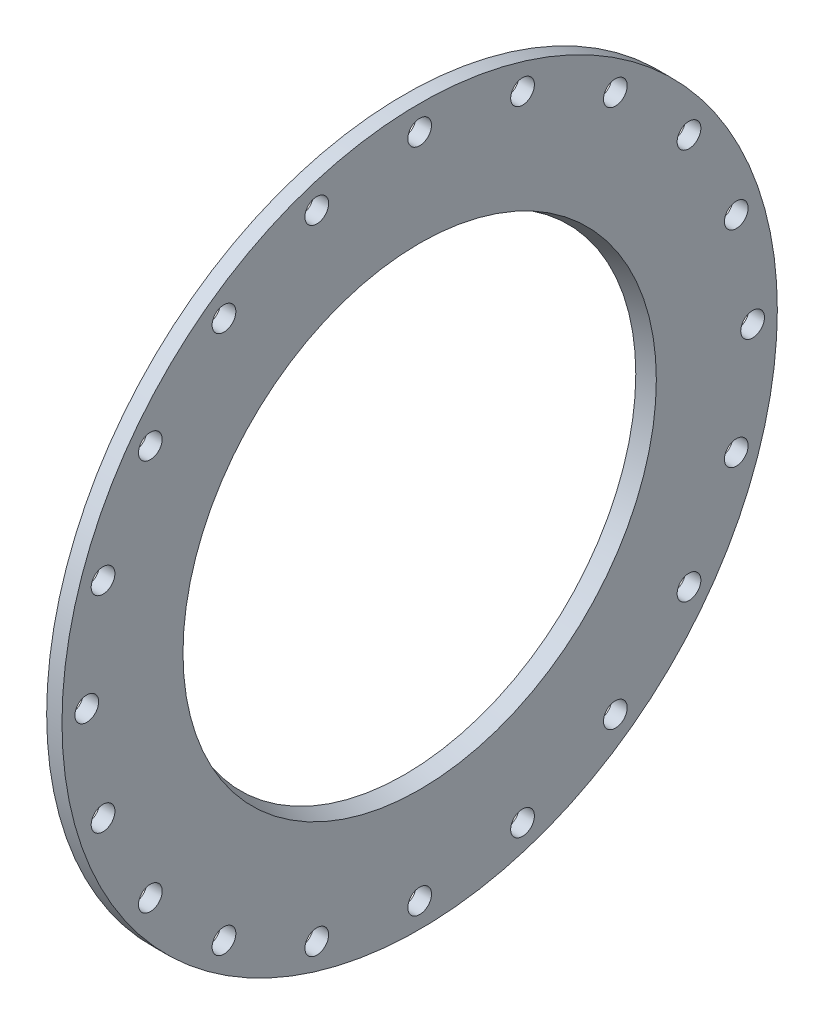
ISO-10303-21;
HEADER;
FILE_DESCRIPTION(('STEP AP214'),'2;1');
FILE_NAME('part.step','',(''),(''),'','','');
FILE_SCHEMA(('AUTOMOTIVE_DESIGN { 1 0 10303 214 1 1 1 1 }'));
ENDSEC;
DATA;
#1=APPLICATION_CONTEXT('core data for automotive mechanical design processes');
#2=APPLICATION_PROTOCOL_DEFINITION('international standard','automotive_design',2000,#1);
#3=PRODUCT_CONTEXT('',#1,'mechanical');
#4=PRODUCT('Part','Part','',(#3));
#5=PRODUCT_RELATED_PRODUCT_CATEGORY('part','',(#4));
#6=PRODUCT_DEFINITION_FORMATION('','',#4);
#7=PRODUCT_DEFINITION_CONTEXT('part definition',#1,'design');
#8=PRODUCT_DEFINITION('design','',#6,#7);
#9=PRODUCT_DEFINITION_SHAPE('','',#8);
#10=(LENGTH_UNIT() NAMED_UNIT(*) SI_UNIT(.MILLI.,.METRE.));
#11=(NAMED_UNIT(*) PLANE_ANGLE_UNIT() SI_UNIT($,.RADIAN.));
#12=(NAMED_UNIT(*) SI_UNIT($,.STERADIAN.) SOLID_ANGLE_UNIT());
#13=UNCERTAINTY_MEASURE_WITH_UNIT(LENGTH_MEASURE(1.E-05),#10,'distance_accuracy_value','');
#14=(GEOMETRIC_REPRESENTATION_CONTEXT(3) GLOBAL_UNCERTAINTY_ASSIGNED_CONTEXT((#13)) GLOBAL_UNIT_ASSIGNED_CONTEXT((#10,
#11,#12)) REPRESENTATION_CONTEXT('',''));
#15=CARTESIAN_POINT('',(0.,0.,0.));
#16=DIRECTION('',(0.,0.,1.));
#17=DIRECTION('',(1.,0.,0.));
#18=AXIS2_PLACEMENT_3D('',#15,#16,#17);
#19=CARTESIAN_POINT('',(79.9592,0.,0.));
#20=DIRECTION('',(1.,0.,0.));
#21=DIRECTION('',(0.,0.,-1.));
#22=AXIS2_PLACEMENT_3D('',#19,#20,#21);
#23=CONICAL_SURFACE('',#22,75.2237755254414,0.328785996406436);
#24=CARTESIAN_POINT('',(3.175,0.,0.));
#25=DIRECTION('',(-1.,0.,0.));
#26=DIRECTION('',(0.,0.,1.));
#27=AXIS2_PLACEMENT_3D('',#24,#25,#26);
#28=CIRCLE('',#27,49.0273870883385);
#29=CARTESIAN_POINT('',(3.175,0.,49.0273870883385));
#30=VERTEX_POINT('',#29);
#31=EDGE_CURVE('E53',#30,#30,#28,.T.);
#32=ORIENTED_EDGE('',*,*,#31,.F.);
#33=EDGE_LOOP('',(#32));
#34=FACE_BOUND('',#33,.T.);
#35=CARTESIAN_POINT('',(0.,0.,0.));
#36=DIRECTION('',(1.,0.,0.));
#37=DIRECTION('',(0.,0.,-1.));
#38=AXIS2_PLACEMENT_3D('',#35,#36,#37);
#39=CIRCLE('',#38,47.9441755254414);
#40=CARTESIAN_POINT('',(0.,0.,-47.9441755254414));
#41=VERTEX_POINT('',#40);
#42=EDGE_CURVE('E11',#41,#41,#39,.F.);
#43=ORIENTED_EDGE('',*,*,#42,.T.);
#44=EDGE_LOOP('',(#43));
#45=FACE_BOUND('',#44,.T.);
#46=ADVANCED_FACE('F46',(#34,#45),#23,.F.);
#47=CARTESIAN_POINT('',(0.,0.,0.));
#48=DIRECTION('',(-1.,0.,0.));
#49=DIRECTION('',(0.,0.,1.));
#50=AXIS2_PLACEMENT_3D('',#47,#48,#49);
#51=CYLINDRICAL_SURFACE('',#50,74.0918);
#52=CARTESIAN_POINT('',(0.,0.,0.));
#53=DIRECTION('',(-1.,0.,0.));
#54=DIRECTION('',(0.,0.,1.));
#55=AXIS2_PLACEMENT_3D('',#52,#53,#54);
#56=CIRCLE('',#55,74.0918);
#57=CARTESIAN_POINT('',(0.,0.,74.0918));
#58=VERTEX_POINT('',#57);
#59=EDGE_CURVE('E59',#58,#58,#56,.T.);
#60=ORIENTED_EDGE('',*,*,#59,.F.);
#61=EDGE_LOOP('',(#60));
#62=FACE_BOUND('',#61,.T.);
#63=CARTESIAN_POINT('',(3.175,0.,0.));
#64=DIRECTION('',(-1.,0.,0.));
#65=DIRECTION('',(0.,0.,1.));
#66=AXIS2_PLACEMENT_3D('',#63,#64,#65);
#67=CIRCLE('',#66,74.0918);
#68=CARTESIAN_POINT('',(3.175,0.,74.0918));
#69=VERTEX_POINT('',#68);
#70=EDGE_CURVE('E64',#69,#69,#67,.T.);
#71=ORIENTED_EDGE('',*,*,#70,.T.);
#72=EDGE_LOOP('',(#71));
#73=FACE_BOUND('',#72,.T.);
#74=ADVANCED_FACE('F287',(#62,#73),#51,.T.);
#75=CARTESIAN_POINT('',(0.,68.961,0.));
#76=DIRECTION('',(-1.,0.,0.));
#77=DIRECTION('',(0.,0.,1.));
#78=AXIS2_PLACEMENT_3D('',#75,#76,#77);
#79=CYLINDRICAL_SURFACE('',#78,2.45745);
#80=CARTESIAN_POINT('',(3.175,68.961,0.));
#81=DIRECTION('',(-1.,0.,0.));
#82=DIRECTION('',(0.,0.,1.));
#83=AXIS2_PLACEMENT_3D('',#80,#81,#82);
#84=CIRCLE('',#83,2.45745);
#85=CARTESIAN_POINT('',(3.175,68.961,2.45745));
#86=VERTEX_POINT('',#85);
#87=EDGE_CURVE('E123',#86,#86,#84,.T.);
#88=ORIENTED_EDGE('',*,*,#87,.F.);
#89=EDGE_LOOP('',(#88));
#90=FACE_BOUND('',#89,.T.);
#91=CARTESIAN_POINT('',(0.,68.961,0.));
#92=DIRECTION('',(-1.,0.,0.));
#93=DIRECTION('',(0.,0.,1.));
#94=AXIS2_PLACEMENT_3D('',#91,#92,#93);
#95=CIRCLE('',#94,2.45745);
#96=CARTESIAN_POINT('',(0.,68.961,2.45745));
#97=VERTEX_POINT('',#96);
#98=EDGE_CURVE('E117',#97,#97,#95,.T.);
#99=ORIENTED_EDGE('',*,*,#98,.T.);
#100=EDGE_LOOP('',(#99));
#101=FACE_BOUND('',#100,.T.);
#102=ADVANCED_FACE('F292',(#90,#101),#79,.F.);
#103=CARTESIAN_POINT('',(0.,65.5858084202301,-21.3101209490908));
#104=DIRECTION('',(-1.,0.,0.));
#105=DIRECTION('',(0.,0.,1.));
#106=AXIS2_PLACEMENT_3D('',#103,#104,#105);
#107=CYLINDRICAL_SURFACE('',#106,2.45745);
#108=CARTESIAN_POINT('',(3.175,65.5858084202301,-21.3101209490908));
#109=DIRECTION('',(-1.,0.,0.));
#110=DIRECTION('',(0.,0.,1.));
#111=AXIS2_PLACEMENT_3D('',#108,#109,#110);
#112=CIRCLE('',#111,2.45745);
#113=CARTESIAN_POINT('',(3.175,65.5858084202301,-18.8526709490908));
#114=VERTEX_POINT('',#113);
#115=EDGE_CURVE('E111',#114,#114,#112,.T.);
#116=ORIENTED_EDGE('',*,*,#115,.F.);
#117=EDGE_LOOP('',(#116));
#118=FACE_BOUND('',#117,.T.);
#119=CARTESIAN_POINT('',(0.,65.5858084202301,-21.3101209490908));
#120=DIRECTION('',(-1.,0.,0.));
#121=DIRECTION('',(0.,0.,1.));
#122=AXIS2_PLACEMENT_3D('',#119,#120,#121);
#123=CIRCLE('',#122,2.45745);
#124=CARTESIAN_POINT('',(0.,65.5858084202301,-18.8526709490908));
#125=VERTEX_POINT('',#124);
#126=EDGE_CURVE('E118',#125,#125,#123,.T.);
#127=ORIENTED_EDGE('',*,*,#126,.T.);
#128=EDGE_LOOP('',(#127));
#129=FACE_BOUND('',#128,.T.);
#130=ADVANCED_FACE('F298',(#118,#129),#107,.F.);
#131=CARTESIAN_POINT('',(0.,55.7906209490907,-40.5342587833413));
#132=DIRECTION('',(-1.,0.,0.));
#133=DIRECTION('',(0.,0.,1.));
#134=AXIS2_PLACEMENT_3D('',#131,#132,#133);
#135=CYLINDRICAL_SURFACE('',#134,2.45745);
#136=CARTESIAN_POINT('',(3.175,55.7906209490907,-40.5342587833413));
#137=DIRECTION('',(-1.,0.,0.));
#138=DIRECTION('',(0.,0.,1.));
#139=AXIS2_PLACEMENT_3D('',#136,#137,#138);
#140=CIRCLE('',#139,2.45745);
#141=CARTESIAN_POINT('',(3.175,55.7906209490907,-38.0768087833413));
#142=VERTEX_POINT('',#141);
#143=EDGE_CURVE('E720',#142,#142,#140,.T.);
#144=ORIENTED_EDGE('',*,*,#143,.F.);
#145=EDGE_LOOP('',(#144));
#146=FACE_BOUND('',#145,.T.);
#147=CARTESIAN_POINT('',(0.,55.7906209490907,-40.5342587833413));
#148=DIRECTION('',(-1.,0.,0.));
#149=DIRECTION('',(0.,0.,1.));
#150=AXIS2_PLACEMENT_3D('',#147,#148,#149);
#151=CIRCLE('',#150,2.45745);
#152=CARTESIAN_POINT('',(0.,55.7906209490907,-38.0768087833413));
#153=VERTEX_POINT('',#152);
#154=EDGE_CURVE('E258',#153,#153,#151,.T.);
#155=ORIENTED_EDGE('',*,*,#154,.T.);
#156=EDGE_LOOP('',(#155));
#157=FACE_BOUND('',#156,.T.);
#158=ADVANCED_FACE('F309',(#146,#157),#135,.F.);
#159=CARTESIAN_POINT('',(0.,40.5342587833411,-55.7906209490908));
#160=DIRECTION('',(-1.,0.,0.));
#161=DIRECTION('',(0.,0.,1.));
#162=AXIS2_PLACEMENT_3D('',#159,#160,#161);
#163=CYLINDRICAL_SURFACE('',#162,2.45745);
#164=CARTESIAN_POINT('',(3.175,40.5342587833411,-55.7906209490908));
#165=DIRECTION('',(-1.,0.,0.));
#166=DIRECTION('',(0.,0.,1.));
#167=AXIS2_PLACEMENT_3D('',#164,#165,#166);
#168=CIRCLE('',#167,2.45745);
#169=CARTESIAN_POINT('',(3.175,40.5342587833411,-53.3331709490908));
#170=VERTEX_POINT('',#169);
#171=EDGE_CURVE('E358',#170,#170,#168,.T.);
#172=ORIENTED_EDGE('',*,*,#171,.F.);
#173=EDGE_LOOP('',(#172));
#174=FACE_BOUND('',#173,.T.);
#175=CARTESIAN_POINT('',(0.,40.5342587833411,-55.7906209490908));
#176=DIRECTION('',(-1.,0.,0.));
#177=DIRECTION('',(0.,0.,1.));
#178=AXIS2_PLACEMENT_3D('',#175,#176,#177);
#179=CIRCLE('',#178,2.45745);
#180=CARTESIAN_POINT('',(0.,40.5342587833411,-53.3331709490908));
#181=VERTEX_POINT('',#180);
#182=EDGE_CURVE('E254',#181,#181,#179,.T.);
#183=ORIENTED_EDGE('',*,*,#182,.T.);
#184=EDGE_LOOP('',(#183));
#185=FACE_BOUND('',#184,.T.);
#186=ADVANCED_FACE('F313',(#174,#185),#163,.F.);
#187=CARTESIAN_POINT('',(0.,21.3101209490906,-65.5858084202302));
#188=DIRECTION('',(-1.,0.,0.));
#189=DIRECTION('',(0.,0.,1.));
#190=AXIS2_PLACEMENT_3D('',#187,#188,#189);
#191=CYLINDRICAL_SURFACE('',#190,2.45745);
#192=CARTESIAN_POINT('',(3.175,21.3101209490906,-65.5858084202302));
#193=DIRECTION('',(-1.,0.,0.));
#194=DIRECTION('',(0.,0.,1.));
#195=AXIS2_PLACEMENT_3D('',#192,#193,#194);
#196=CIRCLE('',#195,2.45745);
#197=CARTESIAN_POINT('',(3.175,21.3101209490906,-63.1283584202301));
#198=VERTEX_POINT('',#197);
#199=EDGE_CURVE('E139',#198,#198,#196,.T.);
#200=ORIENTED_EDGE('',*,*,#199,.F.);
#201=EDGE_LOOP('',(#200));
#202=FACE_BOUND('',#201,.T.);
#203=CARTESIAN_POINT('',(0.,21.3101209490906,-65.5858084202302));
#204=DIRECTION('',(-1.,0.,0.));
#205=DIRECTION('',(0.,0.,1.));
#206=AXIS2_PLACEMENT_3D('',#203,#204,#205);
#207=CIRCLE('',#206,2.45745);
#208=CARTESIAN_POINT('',(0.,21.3101209490906,-63.1283584202301));
#209=VERTEX_POINT('',#208);
#210=EDGE_CURVE('E133',#209,#209,#207,.T.);
#211=ORIENTED_EDGE('',*,*,#210,.T.);
#212=EDGE_LOOP('',(#211));
#213=FACE_BOUND('',#212,.T.);
#214=ADVANCED_FACE('F317',(#202,#213),#191,.F.);
#215=CARTESIAN_POINT('',(0.,-2.40776044607961E-13,-68.961));
#216=DIRECTION('',(-1.,0.,0.));
#217=DIRECTION('',(0.,0.,1.));
#218=AXIS2_PLACEMENT_3D('',#215,#216,#217);
#219=CYLINDRICAL_SURFACE('',#218,2.45745);
#220=CARTESIAN_POINT('',(3.175,-2.40776044607961E-13,-68.961));
#221=DIRECTION('',(-1.,0.,0.));
#222=DIRECTION('',(0.,0.,1.));
#223=AXIS2_PLACEMENT_3D('',#220,#221,#222);
#224=CIRCLE('',#223,2.45745);
#225=CARTESIAN_POINT('',(3.175,-2.40776044607961E-13,-66.50355));
#226=VERTEX_POINT('',#225);
#227=EDGE_CURVE('E140',#226,#226,#224,.T.);
#228=ORIENTED_EDGE('',*,*,#227,.F.);
#229=EDGE_LOOP('',(#228));
#230=FACE_BOUND('',#229,.T.);
#231=CARTESIAN_POINT('',(0.,-2.40776044607961E-13,-68.961));
#232=DIRECTION('',(-1.,0.,0.));
#233=DIRECTION('',(0.,0.,1.));
#234=AXIS2_PLACEMENT_3D('',#231,#232,#233);
#235=CIRCLE('',#234,2.45745);
#236=CARTESIAN_POINT('',(0.,-2.40776044607961E-13,-66.50355));
#237=VERTEX_POINT('',#236);
#238=EDGE_CURVE('E250',#237,#237,#235,.T.);
#239=ORIENTED_EDGE('',*,*,#238,.T.);
#240=EDGE_LOOP('',(#239));
#241=FACE_BOUND('',#240,.T.);
#242=ADVANCED_FACE('F321',(#230,#241),#219,.F.);
#243=CARTESIAN_POINT('',(0.,-21.310120949091,-65.58580842023));
#244=DIRECTION('',(-1.,0.,0.));
#245=DIRECTION('',(0.,0.,1.));
#246=AXIS2_PLACEMENT_3D('',#243,#244,#245);
#247=CYLINDRICAL_SURFACE('',#246,2.45745);
#248=CARTESIAN_POINT('',(3.175,-21.310120949091,-65.58580842023));
#249=DIRECTION('',(-1.,0.,0.));
#250=DIRECTION('',(0.,0.,1.));
#251=AXIS2_PLACEMENT_3D('',#248,#249,#250);
#252=CIRCLE('',#251,2.45745);
#253=CARTESIAN_POINT('',(3.175,-21.310120949091,-63.12835842023));
#254=VERTEX_POINT('',#253);
#255=EDGE_CURVE('E333',#254,#254,#252,.T.);
#256=ORIENTED_EDGE('',*,*,#255,.F.);
#257=EDGE_LOOP('',(#256));
#258=FACE_BOUND('',#257,.T.);
#259=CARTESIAN_POINT('',(0.,-21.310120949091,-65.58580842023));
#260=DIRECTION('',(-1.,0.,0.));
#261=DIRECTION('',(0.,0.,1.));
#262=AXIS2_PLACEMENT_3D('',#259,#260,#261);
#263=CIRCLE('',#262,2.45745);
#264=CARTESIAN_POINT('',(0.,-21.310120949091,-63.12835842023));
#265=VERTEX_POINT('',#264);
#266=EDGE_CURVE('E246',#265,#265,#263,.T.);
#267=ORIENTED_EDGE('',*,*,#266,.T.);
#268=EDGE_LOOP('',(#267));
#269=FACE_BOUND('',#268,.T.);
#270=ADVANCED_FACE('F282',(#258,#269),#247,.F.);
#271=CARTESIAN_POINT('',(0.,-40.5342587833415,-55.7906209490905));
#272=DIRECTION('',(-1.,0.,0.));
#273=DIRECTION('',(0.,0.,1.));
#274=AXIS2_PLACEMENT_3D('',#271,#272,#273);
#275=CYLINDRICAL_SURFACE('',#274,2.45745);
#276=CARTESIAN_POINT('',(3.175,-40.5342587833415,-55.7906209490905));
#277=DIRECTION('',(-1.,0.,0.));
#278=DIRECTION('',(0.,0.,1.));
#279=AXIS2_PLACEMENT_3D('',#276,#277,#278);
#280=CIRCLE('',#279,2.45745);
#281=CARTESIAN_POINT('',(3.175,-40.5342587833415,-53.3331709490906));
#282=VERTEX_POINT('',#281);
#283=EDGE_CURVE('E335',#282,#282,#280,.T.);
#284=ORIENTED_EDGE('',*,*,#283,.F.);
#285=EDGE_LOOP('',(#284));
#286=FACE_BOUND('',#285,.T.);
#287=CARTESIAN_POINT('',(0.,-40.5342587833415,-55.7906209490905));
#288=DIRECTION('',(-1.,0.,0.));
#289=DIRECTION('',(0.,0.,1.));
#290=AXIS2_PLACEMENT_3D('',#287,#288,#289);
#291=CIRCLE('',#290,2.45745);
#292=CARTESIAN_POINT('',(0.,-40.5342587833415,-53.3331709490906));
#293=VERTEX_POINT('',#292);
#294=EDGE_CURVE('E165',#293,#293,#291,.T.);
#295=ORIENTED_EDGE('',*,*,#294,.T.);
#296=EDGE_LOOP('',(#295));
#297=FACE_BOUND('',#296,.T.);
#298=ADVANCED_FACE('F273',(#286,#297),#275,.F.);
#299=CARTESIAN_POINT('',(0.,-55.790620949091,-40.5342587833409));
#300=DIRECTION('',(-1.,0.,0.));
#301=DIRECTION('',(0.,0.,1.));
#302=AXIS2_PLACEMENT_3D('',#299,#300,#301);
#303=CYLINDRICAL_SURFACE('',#302,2.45745);
#304=CARTESIAN_POINT('',(3.175,-55.790620949091,-40.5342587833409));
#305=DIRECTION('',(-1.,0.,0.));
#306=DIRECTION('',(0.,0.,1.));
#307=AXIS2_PLACEMENT_3D('',#304,#305,#306);
#308=CIRCLE('',#307,2.45745);
#309=CARTESIAN_POINT('',(3.175,-55.790620949091,-38.0768087833409));
#310=VERTEX_POINT('',#309);
#311=EDGE_CURVE('E156',#310,#310,#308,.T.);
#312=ORIENTED_EDGE('',*,*,#311,.F.);
#313=EDGE_LOOP('',(#312));
#314=FACE_BOUND('',#313,.T.);
#315=CARTESIAN_POINT('',(0.,-55.790620949091,-40.5342587833409));
#316=DIRECTION('',(-1.,0.,0.));
#317=DIRECTION('',(0.,0.,1.));
#318=AXIS2_PLACEMENT_3D('',#315,#316,#317);
#319=CIRCLE('',#318,2.45745);
#320=CARTESIAN_POINT('',(0.,-55.790620949091,-38.0768087833409));
#321=VERTEX_POINT('',#320);
#322=EDGE_CURVE('E150',#321,#321,#319,.T.);
#323=ORIENTED_EDGE('',*,*,#322,.T.);
#324=EDGE_LOOP('',(#323));
#325=FACE_BOUND('',#324,.T.);
#326=ADVANCED_FACE('F271',(#314,#325),#303,.F.);
#327=CARTESIAN_POINT('',(0.,-65.5858084202302,-21.3101209490903));
#328=DIRECTION('',(-1.,0.,0.));
#329=DIRECTION('',(0.,0.,1.));
#330=AXIS2_PLACEMENT_3D('',#327,#328,#329);
#331=CYLINDRICAL_SURFACE('',#330,2.45745);
#332=CARTESIAN_POINT('',(3.175,-65.5858084202302,-21.3101209490903));
#333=DIRECTION('',(-1.,0.,0.));
#334=DIRECTION('',(0.,0.,1.));
#335=AXIS2_PLACEMENT_3D('',#332,#333,#334);
#336=CIRCLE('',#335,2.45745);
#337=CARTESIAN_POINT('',(3.175,-65.5858084202302,-18.8526709490903));
#338=VERTEX_POINT('',#337);
#339=EDGE_CURVE('E157',#338,#338,#336,.T.);
#340=ORIENTED_EDGE('',*,*,#339,.F.);
#341=EDGE_LOOP('',(#340));
#342=FACE_BOUND('',#341,.T.);
#343=CARTESIAN_POINT('',(0.,-65.5858084202302,-21.3101209490903));
#344=DIRECTION('',(-1.,0.,0.));
#345=DIRECTION('',(0.,0.,1.));
#346=AXIS2_PLACEMENT_3D('',#343,#344,#345);
#347=CIRCLE('',#346,2.45745);
#348=CARTESIAN_POINT('',(0.,-65.5858084202302,-18.8526709490903));
#349=VERTEX_POINT('',#348);
#350=EDGE_CURVE('E211',#349,#349,#347,.T.);
#351=ORIENTED_EDGE('',*,*,#350,.T.);
#352=EDGE_LOOP('',(#351));
#353=FACE_BOUND('',#352,.T.);
#354=ADVANCED_FACE('F231',(#342,#353),#331,.F.);
#355=CARTESIAN_POINT('',(0.,-68.961,0.));
#356=DIRECTION('',(-1.,0.,0.));
#357=DIRECTION('',(0.,0.,1.));
#358=AXIS2_PLACEMENT_3D('',#355,#356,#357);
#359=CYLINDRICAL_SURFACE('',#358,2.45745);
#360=CARTESIAN_POINT('',(3.175,-68.961,0.));
#361=DIRECTION('',(-1.,0.,0.));
#362=DIRECTION('',(0.,0.,1.));
#363=AXIS2_PLACEMENT_3D('',#360,#361,#362);
#364=CIRCLE('',#363,2.45745);
#365=CARTESIAN_POINT('',(3.175,-68.961,2.45745));
#366=VERTEX_POINT('',#365);
#367=EDGE_CURVE('E205',#366,#366,#364,.T.);
#368=ORIENTED_EDGE('',*,*,#367,.F.);
#369=EDGE_LOOP('',(#368));
#370=FACE_BOUND('',#369,.T.);
#371=CARTESIAN_POINT('',(0.,-68.961,0.));
#372=DIRECTION('',(-1.,0.,0.));
#373=DIRECTION('',(0.,0.,1.));
#374=AXIS2_PLACEMENT_3D('',#371,#372,#373);
#375=CIRCLE('',#374,2.45745);
#376=CARTESIAN_POINT('',(0.,-68.961,2.45745));
#377=VERTEX_POINT('',#376);
#378=EDGE_CURVE('E201',#377,#377,#375,.T.);
#379=ORIENTED_EDGE('',*,*,#378,.T.);
#380=EDGE_LOOP('',(#379));
#381=FACE_BOUND('',#380,.T.);
#382=ADVANCED_FACE('F227',(#370,#381),#359,.F.);
#383=CARTESIAN_POINT('',(0.,-65.5858084202299,21.3101209490913));
#384=DIRECTION('',(-1.,0.,0.));
#385=DIRECTION('',(0.,0.,1.));
#386=AXIS2_PLACEMENT_3D('',#383,#384,#385);
#387=CYLINDRICAL_SURFACE('',#386,2.45745);
#388=CARTESIAN_POINT('',(3.175,-65.5858084202299,21.3101209490913));
#389=DIRECTION('',(-1.,0.,0.));
#390=DIRECTION('',(0.,0.,1.));
#391=AXIS2_PLACEMENT_3D('',#388,#389,#390);
#392=CIRCLE('',#391,2.45745);
#393=CARTESIAN_POINT('',(3.175,-65.5858084202299,23.7675709490913));
#394=VERTEX_POINT('',#393);
#395=EDGE_CURVE('E188',#394,#394,#392,.T.);
#396=ORIENTED_EDGE('',*,*,#395,.F.);
#397=EDGE_LOOP('',(#396));
#398=FACE_BOUND('',#397,.T.);
#399=CARTESIAN_POINT('',(0.,-65.5858084202299,21.3101209490913));
#400=DIRECTION('',(-1.,0.,0.));
#401=DIRECTION('',(0.,0.,1.));
#402=AXIS2_PLACEMENT_3D('',#399,#400,#401);
#403=CIRCLE('',#402,2.45745);
#404=CARTESIAN_POINT('',(0.,-65.5858084202299,23.7675709490913));
#405=VERTEX_POINT('',#404);
#406=EDGE_CURVE('E181',#405,#405,#403,.T.);
#407=ORIENTED_EDGE('',*,*,#406,.T.);
#408=EDGE_LOOP('',(#407));
#409=FACE_BOUND('',#408,.T.);
#410=ADVANCED_FACE('F230',(#398,#409),#387,.F.);
#411=CARTESIAN_POINT('',(0.,-55.7906209490904,40.5342587833417));
#412=DIRECTION('',(-1.,0.,0.));
#413=DIRECTION('',(0.,0.,1.));
#414=AXIS2_PLACEMENT_3D('',#411,#412,#413);
#415=CYLINDRICAL_SURFACE('',#414,2.45745);
#416=CARTESIAN_POINT('',(3.175,-55.7906209490904,40.5342587833417));
#417=DIRECTION('',(-1.,0.,0.));
#418=DIRECTION('',(0.,0.,1.));
#419=AXIS2_PLACEMENT_3D('',#416,#417,#418);
#420=CIRCLE('',#419,2.45745);
#421=CARTESIAN_POINT('',(3.175,-55.7906209490904,42.9917087833417));
#422=VERTEX_POINT('',#421);
#423=EDGE_CURVE('E175',#422,#422,#420,.T.);
#424=ORIENTED_EDGE('',*,*,#423,.F.);
#425=EDGE_LOOP('',(#424));
#426=FACE_BOUND('',#425,.T.);
#427=CARTESIAN_POINT('',(0.,-55.7906209490904,40.5342587833417));
#428=DIRECTION('',(-1.,0.,0.));
#429=DIRECTION('',(0.,0.,1.));
#430=AXIS2_PLACEMENT_3D('',#427,#428,#429);
#431=CIRCLE('',#430,2.45745);
#432=CARTESIAN_POINT('',(0.,-55.7906209490904,42.9917087833417));
#433=VERTEX_POINT('',#432);
#434=EDGE_CURVE('E182',#433,#433,#431,.T.);
#435=ORIENTED_EDGE('',*,*,#434,.T.);
#436=EDGE_LOOP('',(#435));
#437=FACE_BOUND('',#436,.T.);
#438=ADVANCED_FACE('F433',(#426,#437),#415,.F.);
#439=CARTESIAN_POINT('',(0.,-40.5342587833407,55.7906209490911));
#440=DIRECTION('',(-1.,0.,0.));
#441=DIRECTION('',(0.,0.,1.));
#442=AXIS2_PLACEMENT_3D('',#439,#440,#441);
#443=CYLINDRICAL_SURFACE('',#442,2.45745);
#444=CARTESIAN_POINT('',(3.175,-40.5342587833407,55.7906209490911));
#445=DIRECTION('',(-1.,0.,0.));
#446=DIRECTION('',(0.,0.,1.));
#447=AXIS2_PLACEMENT_3D('',#444,#445,#446);
#448=CIRCLE('',#447,2.45745);
#449=CARTESIAN_POINT('',(3.175,-40.5342587833407,58.2480709490911));
#450=VERTEX_POINT('',#449);
#451=EDGE_CURVE('E413',#450,#450,#448,.T.);
#452=ORIENTED_EDGE('',*,*,#451,.F.);
#453=EDGE_LOOP('',(#452));
#454=FACE_BOUND('',#453,.T.);
#455=CARTESIAN_POINT('',(0.,-40.5342587833407,55.7906209490911));
#456=DIRECTION('',(-1.,0.,0.));
#457=DIRECTION('',(0.,0.,1.));
#458=AXIS2_PLACEMENT_3D('',#455,#456,#457);
#459=CIRCLE('',#458,2.45745);
#460=CARTESIAN_POINT('',(0.,-40.5342587833407,58.2480709490911));
#461=VERTEX_POINT('',#460);
#462=EDGE_CURVE('E407',#461,#461,#459,.T.);
#463=ORIENTED_EDGE('',*,*,#462,.T.);
#464=EDGE_LOOP('',(#463));
#465=FACE_BOUND('',#464,.T.);
#466=ADVANCED_FACE('F425',(#454,#465),#443,.F.);
#467=CARTESIAN_POINT('',(0.,-21.3101209490901,65.5858084202303));
#468=DIRECTION('',(-1.,0.,0.));
#469=DIRECTION('',(0.,0.,1.));
#470=AXIS2_PLACEMENT_3D('',#467,#468,#469);
#471=CYLINDRICAL_SURFACE('',#470,2.45745);
#472=CARTESIAN_POINT('',(3.175,-21.3101209490901,65.5858084202303));
#473=DIRECTION('',(-1.,0.,0.));
#474=DIRECTION('',(0.,0.,1.));
#475=AXIS2_PLACEMENT_3D('',#472,#473,#474);
#476=CIRCLE('',#475,2.45745);
#477=CARTESIAN_POINT('',(3.175,-21.3101209490901,68.0432584202303));
#478=VERTEX_POINT('',#477);
#479=EDGE_CURVE('E402',#478,#478,#476,.T.);
#480=ORIENTED_EDGE('',*,*,#479,.F.);
#481=EDGE_LOOP('',(#480));
#482=FACE_BOUND('',#481,.T.);
#483=CARTESIAN_POINT('',(0.,-21.3101209490901,65.5858084202303));
#484=DIRECTION('',(-1.,0.,0.));
#485=DIRECTION('',(0.,0.,1.));
#486=AXIS2_PLACEMENT_3D('',#483,#484,#485);
#487=CIRCLE('',#486,2.45745);
#488=CARTESIAN_POINT('',(0.,-21.3101209490901,68.0432584202303));
#489=VERTEX_POINT('',#488);
#490=EDGE_CURVE('E397',#489,#489,#487,.T.);
#491=ORIENTED_EDGE('',*,*,#490,.T.);
#492=EDGE_LOOP('',(#491));
#493=FACE_BOUND('',#492,.T.);
#494=ADVANCED_FACE('F445',(#482,#493),#471,.F.);
#495=CARTESIAN_POINT('',(0.,7.22328133823884E-13,68.961));
#496=DIRECTION('',(-1.,0.,0.));
#497=DIRECTION('',(0.,0.,1.));
#498=AXIS2_PLACEMENT_3D('',#495,#496,#497);
#499=CYLINDRICAL_SURFACE('',#498,2.45745);
#500=CARTESIAN_POINT('',(3.175,7.22328133823884E-13,68.961));
#501=DIRECTION('',(-1.,0.,0.));
#502=DIRECTION('',(0.,0.,1.));
#503=AXIS2_PLACEMENT_3D('',#500,#501,#502);
#504=CIRCLE('',#503,2.45745);
#505=CARTESIAN_POINT('',(3.175,7.22328133823884E-13,71.41845));
#506=VERTEX_POINT('',#505);
#507=EDGE_CURVE('E391',#506,#506,#504,.T.);
#508=ORIENTED_EDGE('',*,*,#507,.F.);
#509=EDGE_LOOP('',(#508));
#510=FACE_BOUND('',#509,.T.);
#511=CARTESIAN_POINT('',(0.,7.22328133823884E-13,68.961));
#512=DIRECTION('',(-1.,0.,0.));
#513=DIRECTION('',(0.,0.,1.));
#514=AXIS2_PLACEMENT_3D('',#511,#512,#513);
#515=CIRCLE('',#514,2.45745);
#516=CARTESIAN_POINT('',(0.,7.22328133823884E-13,71.41845));
#517=VERTEX_POINT('',#516);
#518=EDGE_CURVE('E386',#517,#517,#515,.T.);
#519=ORIENTED_EDGE('',*,*,#518,.T.);
#520=EDGE_LOOP('',(#519));
#521=FACE_BOUND('',#520,.T.);
#522=ADVANCED_FACE('F449',(#510,#521),#499,.F.);
#523=CARTESIAN_POINT('',(0.,21.3101209490915,65.5858084202299));
#524=DIRECTION('',(-1.,0.,0.));
#525=DIRECTION('',(0.,0.,1.));
#526=AXIS2_PLACEMENT_3D('',#523,#524,#525);
#527=CYLINDRICAL_SURFACE('',#526,2.45745);
#528=CARTESIAN_POINT('',(3.175,21.3101209490915,65.5858084202299));
#529=DIRECTION('',(-1.,0.,0.));
#530=DIRECTION('',(0.,0.,1.));
#531=AXIS2_PLACEMENT_3D('',#528,#529,#530);
#532=CIRCLE('',#531,2.45745);
#533=CARTESIAN_POINT('',(3.175,21.3101209490915,68.0432584202298));
#534=VERTEX_POINT('',#533);
#535=EDGE_CURVE('E377',#534,#534,#532,.T.);
#536=ORIENTED_EDGE('',*,*,#535,.F.);
#537=EDGE_LOOP('',(#536));
#538=FACE_BOUND('',#537,.T.);
#539=CARTESIAN_POINT('',(0.,21.3101209490915,65.5858084202299));
#540=DIRECTION('',(-1.,0.,0.));
#541=DIRECTION('',(0.,0.,1.));
#542=AXIS2_PLACEMENT_3D('',#539,#540,#541);
#543=CIRCLE('',#542,2.45745);
#544=CARTESIAN_POINT('',(0.,21.3101209490915,68.0432584202298));
#545=VERTEX_POINT('',#544);
#546=EDGE_CURVE('E373',#545,#545,#543,.T.);
#547=ORIENTED_EDGE('',*,*,#546,.T.);
#548=EDGE_LOOP('',(#547));
#549=FACE_BOUND('',#548,.T.);
#550=ADVANCED_FACE('F453',(#538,#549),#527,.F.);
#551=CARTESIAN_POINT('',(0.,40.5342587833419,55.7906209490902));
#552=DIRECTION('',(-1.,0.,0.));
#553=DIRECTION('',(0.,0.,1.));
#554=AXIS2_PLACEMENT_3D('',#551,#552,#553);
#555=CYLINDRICAL_SURFACE('',#554,2.45745);
#556=CARTESIAN_POINT('',(3.175,40.5342587833419,55.7906209490902));
#557=DIRECTION('',(-1.,0.,0.));
#558=DIRECTION('',(0.,0.,1.));
#559=AXIS2_PLACEMENT_3D('',#556,#557,#558);
#560=CIRCLE('',#559,2.45745);
#561=CARTESIAN_POINT('',(3.175,40.5342587833419,58.2480709490902));
#562=VERTEX_POINT('',#561);
#563=EDGE_CURVE('E368',#562,#562,#560,.T.);
#564=ORIENTED_EDGE('',*,*,#563,.F.);
#565=EDGE_LOOP('',(#564));
#566=FACE_BOUND('',#565,.T.);
#567=CARTESIAN_POINT('',(0.,40.5342587833419,55.7906209490902));
#568=DIRECTION('',(-1.,0.,0.));
#569=DIRECTION('',(0.,0.,1.));
#570=AXIS2_PLACEMENT_3D('',#567,#568,#569);
#571=CIRCLE('',#570,2.45745);
#572=CARTESIAN_POINT('',(0.,40.5342587833419,58.2480709490902));
#573=VERTEX_POINT('',#572);
#574=EDGE_CURVE('E102',#573,#573,#571,.T.);
#575=ORIENTED_EDGE('',*,*,#574,.T.);
#576=EDGE_LOOP('',(#575));
#577=FACE_BOUND('',#576,.T.);
#578=ADVANCED_FACE('F457',(#566,#577),#555,.F.);
#579=CARTESIAN_POINT('',(0.,55.7906209490913,40.5342587833405));
#580=DIRECTION('',(-1.,0.,0.));
#581=DIRECTION('',(0.,0.,1.));
#582=AXIS2_PLACEMENT_3D('',#579,#580,#581);
#583=CYLINDRICAL_SURFACE('',#582,2.45745);
#584=CARTESIAN_POINT('',(3.175,55.7906209490913,40.5342587833405));
#585=DIRECTION('',(-1.,0.,0.));
#586=DIRECTION('',(0.,0.,1.));
#587=AXIS2_PLACEMENT_3D('',#584,#585,#586);
#588=CIRCLE('',#587,2.45745);
#589=CARTESIAN_POINT('',(3.175,55.7906209490913,42.9917087833405));
#590=VERTEX_POINT('',#589);
#591=EDGE_CURVE('E97',#590,#590,#588,.T.);
#592=ORIENTED_EDGE('',*,*,#591,.F.);
#593=EDGE_LOOP('',(#592));
#594=FACE_BOUND('',#593,.T.);
#595=CARTESIAN_POINT('',(0.,55.7906209490913,40.5342587833405));
#596=DIRECTION('',(-1.,0.,0.));
#597=DIRECTION('',(0.,0.,1.));
#598=AXIS2_PLACEMENT_3D('',#595,#596,#597);
#599=CIRCLE('',#598,2.45745);
#600=CARTESIAN_POINT('',(0.,55.7906209490913,42.9917087833405));
#601=VERTEX_POINT('',#600);
#602=EDGE_CURVE('E92',#601,#601,#599,.T.);
#603=ORIENTED_EDGE('',*,*,#602,.T.);
#604=EDGE_LOOP('',(#603));
#605=FACE_BOUND('',#604,.T.);
#606=ADVANCED_FACE('F461',(#594,#605),#583,.F.);
#607=CARTESIAN_POINT('',(0.,65.5858084202304,21.3101209490899));
#608=DIRECTION('',(-1.,0.,0.));
#609=DIRECTION('',(0.,0.,1.));
#610=AXIS2_PLACEMENT_3D('',#607,#608,#609);
#611=CYLINDRICAL_SURFACE('',#610,2.45745);
#612=CARTESIAN_POINT('',(3.175,65.5858084202304,21.3101209490899));
#613=DIRECTION('',(-1.,0.,0.));
#614=DIRECTION('',(0.,0.,1.));
#615=AXIS2_PLACEMENT_3D('',#612,#613,#614);
#616=CIRCLE('',#615,2.45745);
#617=CARTESIAN_POINT('',(3.175,65.5858084202304,23.7675709490899));
#618=VERTEX_POINT('',#617);
#619=EDGE_CURVE('E85',#618,#618,#616,.T.);
#620=ORIENTED_EDGE('',*,*,#619,.F.);
#621=EDGE_LOOP('',(#620));
#622=FACE_BOUND('',#621,.T.);
#623=CARTESIAN_POINT('',(0.,65.5858084202304,21.3101209490899));
#624=DIRECTION('',(-1.,0.,0.));
#625=DIRECTION('',(0.,0.,1.));
#626=AXIS2_PLACEMENT_3D('',#623,#624,#625);
#627=CIRCLE('',#626,2.45745);
#628=CARTESIAN_POINT('',(0.,65.5858084202304,23.7675709490899));
#629=VERTEX_POINT('',#628);
#630=EDGE_CURVE('E80',#629,#629,#627,.T.);
#631=ORIENTED_EDGE('',*,*,#630,.T.);
#632=EDGE_LOOP('',(#631));
#633=FACE_BOUND('',#632,.T.);
#634=ADVANCED_FACE('F304',(#622,#633),#611,.F.);
#635=CARTESIAN_POINT('',(3.175,49.0273870883385,0.));
#636=DIRECTION('',(-1.,0.,0.));
#637=DIRECTION('',(0.,0.,1.));
#638=AXIS2_PLACEMENT_3D('',#635,#636,#637);
#639=PLANE('',#638);
#640=ORIENTED_EDGE('',*,*,#619,.T.);
#641=EDGE_LOOP('',(#640));
#642=FACE_BOUND('',#641,.T.);
#643=ORIENTED_EDGE('',*,*,#591,.T.);
#644=EDGE_LOOP('',(#643));
#645=FACE_BOUND('',#644,.T.);
#646=ORIENTED_EDGE('',*,*,#563,.T.);
#647=EDGE_LOOP('',(#646));
#648=FACE_BOUND('',#647,.T.);
#649=ORIENTED_EDGE('',*,*,#535,.T.);
#650=EDGE_LOOP('',(#649));
#651=FACE_BOUND('',#650,.T.);
#652=ORIENTED_EDGE('',*,*,#507,.T.);
#653=EDGE_LOOP('',(#652));
#654=FACE_BOUND('',#653,.T.);
#655=ORIENTED_EDGE('',*,*,#479,.T.);
#656=EDGE_LOOP('',(#655));
#657=FACE_BOUND('',#656,.T.);
#658=ORIENTED_EDGE('',*,*,#451,.T.);
#659=EDGE_LOOP('',(#658));
#660=FACE_BOUND('',#659,.T.);
#661=ORIENTED_EDGE('',*,*,#423,.T.);
#662=EDGE_LOOP('',(#661));
#663=FACE_BOUND('',#662,.T.);
#664=ORIENTED_EDGE('',*,*,#395,.T.);
#665=EDGE_LOOP('',(#664));
#666=FACE_BOUND('',#665,.T.);
#667=ORIENTED_EDGE('',*,*,#367,.T.);
#668=EDGE_LOOP('',(#667));
#669=FACE_BOUND('',#668,.T.);
#670=ORIENTED_EDGE('',*,*,#339,.T.);
#671=EDGE_LOOP('',(#670));
#672=FACE_BOUND('',#671,.T.);
#673=ORIENTED_EDGE('',*,*,#311,.T.);
#674=EDGE_LOOP('',(#673));
#675=FACE_BOUND('',#674,.T.);
#676=ORIENTED_EDGE('',*,*,#283,.T.);
#677=EDGE_LOOP('',(#676));
#678=FACE_BOUND('',#677,.T.);
#679=ORIENTED_EDGE('',*,*,#255,.T.);
#680=EDGE_LOOP('',(#679));
#681=FACE_BOUND('',#680,.T.);
#682=ORIENTED_EDGE('',*,*,#227,.T.);
#683=EDGE_LOOP('',(#682));
#684=FACE_BOUND('',#683,.T.);
#685=ORIENTED_EDGE('',*,*,#199,.T.);
#686=EDGE_LOOP('',(#685));
#687=FACE_BOUND('',#686,.T.);
#688=ORIENTED_EDGE('',*,*,#171,.T.);
#689=EDGE_LOOP('',(#688));
#690=FACE_BOUND('',#689,.T.);
#691=ORIENTED_EDGE('',*,*,#143,.T.);
#692=EDGE_LOOP('',(#691));
#693=FACE_BOUND('',#692,.T.);
#694=ORIENTED_EDGE('',*,*,#115,.T.);
#695=EDGE_LOOP('',(#694));
#696=FACE_BOUND('',#695,.T.);
#697=ORIENTED_EDGE('',*,*,#87,.T.);
#698=EDGE_LOOP('',(#697));
#699=FACE_BOUND('',#698,.T.);
#700=ORIENTED_EDGE('',*,*,#70,.F.);
#701=EDGE_LOOP('',(#700));
#702=FACE_BOUND('',#701,.T.);
#703=ORIENTED_EDGE('',*,*,#31,.T.);
#704=EDGE_LOOP('',(#703));
#705=FACE_BOUND('',#704,.T.);
#706=ADVANCED_FACE('F224',(#642,#645,#648,#651,#654,#657,#660,#663,#666,#669,#672,#675,#678,
#681,#684,#687,#690,#693,#696,#699,#702,#705),#639,.F.);
#707=CARTESIAN_POINT('',(0.,47.6758,0.));
#708=DIRECTION('',(1.,0.,0.));
#709=DIRECTION('',(0.,0.,-1.));
#710=AXIS2_PLACEMENT_3D('',#707,#708,#709);
#711=PLANE('',#710);
#712=ORIENTED_EDGE('',*,*,#630,.F.);
#713=EDGE_LOOP('',(#712));
#714=FACE_BOUND('',#713,.T.);
#715=ORIENTED_EDGE('',*,*,#602,.F.);
#716=EDGE_LOOP('',(#715));
#717=FACE_BOUND('',#716,.T.);
#718=ORIENTED_EDGE('',*,*,#574,.F.);
#719=EDGE_LOOP('',(#718));
#720=FACE_BOUND('',#719,.T.);
#721=ORIENTED_EDGE('',*,*,#546,.F.);
#722=EDGE_LOOP('',(#721));
#723=FACE_BOUND('',#722,.T.);
#724=ORIENTED_EDGE('',*,*,#518,.F.);
#725=EDGE_LOOP('',(#724));
#726=FACE_BOUND('',#725,.T.);
#727=ORIENTED_EDGE('',*,*,#490,.F.);
#728=EDGE_LOOP('',(#727));
#729=FACE_BOUND('',#728,.T.);
#730=ORIENTED_EDGE('',*,*,#462,.F.);
#731=EDGE_LOOP('',(#730));
#732=FACE_BOUND('',#731,.T.);
#733=ORIENTED_EDGE('',*,*,#434,.F.);
#734=EDGE_LOOP('',(#733));
#735=FACE_BOUND('',#734,.T.);
#736=ORIENTED_EDGE('',*,*,#406,.F.);
#737=EDGE_LOOP('',(#736));
#738=FACE_BOUND('',#737,.T.);
#739=ORIENTED_EDGE('',*,*,#378,.F.);
#740=EDGE_LOOP('',(#739));
#741=FACE_BOUND('',#740,.T.);
#742=ORIENTED_EDGE('',*,*,#350,.F.);
#743=EDGE_LOOP('',(#742));
#744=FACE_BOUND('',#743,.T.);
#745=ORIENTED_EDGE('',*,*,#294,.F.);
#746=EDGE_LOOP('',(#745));
#747=FACE_BOUND('',#746,.T.);
#748=ORIENTED_EDGE('',*,*,#266,.F.);
#749=EDGE_LOOP('',(#748));
#750=FACE_BOUND('',#749,.T.);
#751=ORIENTED_EDGE('',*,*,#238,.F.);
#752=EDGE_LOOP('',(#751));
#753=FACE_BOUND('',#752,.T.);
#754=ORIENTED_EDGE('',*,*,#182,.F.);
#755=EDGE_LOOP('',(#754));
#756=FACE_BOUND('',#755,.T.);
#757=ORIENTED_EDGE('',*,*,#154,.F.);
#758=EDGE_LOOP('',(#757));
#759=FACE_BOUND('',#758,.T.);
#760=ORIENTED_EDGE('',*,*,#126,.F.);
#761=EDGE_LOOP('',(#760));
#762=FACE_BOUND('',#761,.T.);
#763=ORIENTED_EDGE('',*,*,#98,.F.);
#764=EDGE_LOOP('',(#763));
#765=FACE_BOUND('',#764,.T.);
#766=ORIENTED_EDGE('',*,*,#59,.T.);
#767=EDGE_LOOP('',(#766));
#768=FACE_BOUND('',#767,.T.);
#769=ORIENTED_EDGE('',*,*,#210,.F.);
#770=EDGE_LOOP('',(#769));
#771=FACE_BOUND('',#770,.T.);
#772=ORIENTED_EDGE('',*,*,#322,.F.);
#773=EDGE_LOOP('',(#772));
#774=FACE_BOUND('',#773,.T.);
#775=ORIENTED_EDGE('',*,*,#42,.F.);
#776=EDGE_LOOP('',(#775));
#777=FACE_BOUND('',#776,.T.);
#778=ADVANCED_FACE('F235',(#714,#717,#720,#723,#726,#729,#732,#735,#738,#741,#744,#747,#750,
#753,#756,#759,#762,#765,#768,#771,#774,#777),#711,.F.);
#779=CLOSED_SHELL('',(#46,#74,#102,#130,#158,#186,#214,#242,#270,#298,#326,#354,#382,#410,#438,
#466,#494,#522,#550,#578,#606,#634,#706,#778));
#780=MANIFOLD_SOLID_BREP('B2',#779);
#781=ADVANCED_BREP_SHAPE_REPRESENTATION('',(#18,#780),#14);
#782=SHAPE_DEFINITION_REPRESENTATION(#9,#781);
ENDSEC;
END-ISO-10303-21;
